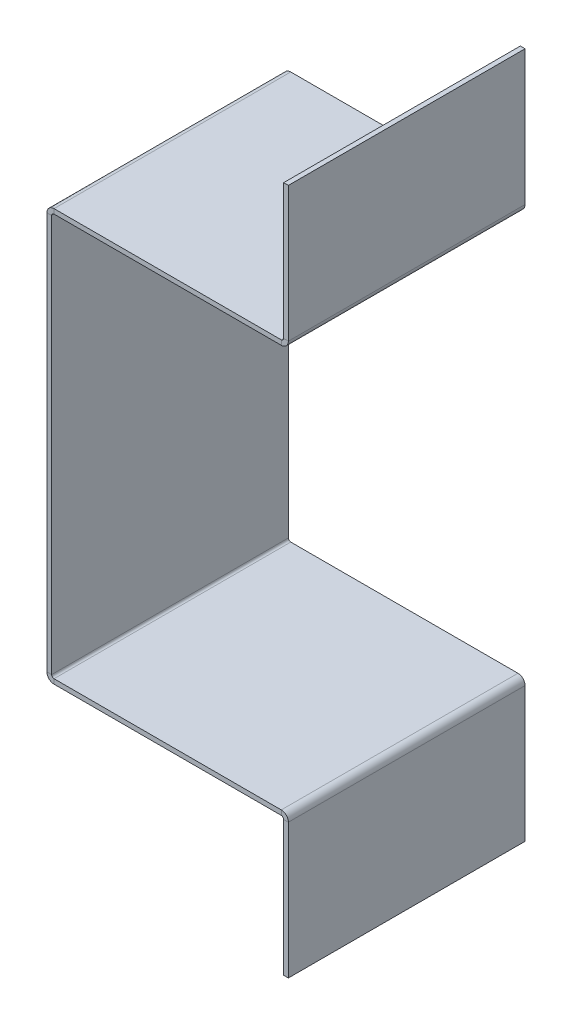
ISO-10303-21;
HEADER;
FILE_DESCRIPTION(('STEP AP214'),'2;1');
FILE_NAME('part.step','',(''),(''),'','','');
FILE_SCHEMA(('AUTOMOTIVE_DESIGN { 1 0 10303 214 1 1 1 1 }'));
ENDSEC;
DATA;
#1=APPLICATION_CONTEXT('core data for automotive mechanical design processes');
#2=APPLICATION_PROTOCOL_DEFINITION('international standard','automotive_design',2000,#1);
#3=PRODUCT_CONTEXT('',#1,'mechanical');
#4=PRODUCT('Part','Part','',(#3));
#5=PRODUCT_RELATED_PRODUCT_CATEGORY('part','',(#4));
#6=PRODUCT_DEFINITION_FORMATION('','',#4);
#7=PRODUCT_DEFINITION_CONTEXT('part definition',#1,'design');
#8=PRODUCT_DEFINITION('design','',#6,#7);
#9=PRODUCT_DEFINITION_SHAPE('','',#8);
#10=(LENGTH_UNIT() NAMED_UNIT(*) SI_UNIT(.MILLI.,.METRE.));
#11=(NAMED_UNIT(*) PLANE_ANGLE_UNIT() SI_UNIT($,.RADIAN.));
#12=(NAMED_UNIT(*) SI_UNIT($,.STERADIAN.) SOLID_ANGLE_UNIT());
#13=UNCERTAINTY_MEASURE_WITH_UNIT(LENGTH_MEASURE(1.E-05),#10,'distance_accuracy_value','');
#14=(GEOMETRIC_REPRESENTATION_CONTEXT(3) GLOBAL_UNCERTAINTY_ASSIGNED_CONTEXT((#13)) GLOBAL_UNIT_ASSIGNED_CONTEXT((#10,
#11,#12)) REPRESENTATION_CONTEXT('',''));
#15=CARTESIAN_POINT('',(0.,0.,0.));
#16=DIRECTION('',(0.,0.,1.));
#17=DIRECTION('',(1.,0.,0.));
#18=AXIS2_PLACEMENT_3D('',#15,#16,#17);
#19=CARTESIAN_POINT('',(-233.505441467645,-82.5271745369763,100.));
#20=DIRECTION('',(0.,0.,1.));
#21=DIRECTION('',(1.,0.,0.));
#22=AXIS2_PLACEMENT_3D('',#19,#20,#21);
#23=PLANE('',#22);
#24=DIRECTION('',(0.,-1.,0.));
#25=VECTOR('',#24,1.);
#26=CARTESIAN_POINT('',(-136.505441467645,-82.5271745369763,100.));
#27=LINE('',#26,#25);
#28=CARTESIAN_POINT('',(-136.505441467645,-82.5271745369763,100.));
#29=VERTEX_POINT('',#28);
#30=CARTESIAN_POINT('',(-136.505441467645,-84.5271745369763,100.));
#31=VERTEX_POINT('',#30);
#32=EDGE_CURVE('E11',#29,#31,#27,.T.);
#33=ORIENTED_EDGE('',*,*,#32,.F.);
#34=DIRECTION('',(1.,0.,0.));
#35=VECTOR('',#34,1.);
#36=CARTESIAN_POINT('',(-233.505441467645,-82.5271745369763,100.));
#37=LINE('',#36,#35);
#38=CARTESIAN_POINT('',(-232.505441467645,-82.5271745369763,100.));
#39=VERTEX_POINT('',#38);
#40=EDGE_CURVE('E232',#39,#29,#37,.T.);
#41=ORIENTED_EDGE('',*,*,#40,.F.);
#42=DIRECTION('',(0.,-1.,0.));
#43=VECTOR('',#42,1.);
#44=CARTESIAN_POINT('',(-232.505441467645,-82.5271745369763,100.));
#45=LINE('',#44,#43);
#46=CARTESIAN_POINT('',(-232.505441467645,-84.5271745369763,100.));
#47=VERTEX_POINT('',#46);
#48=EDGE_CURVE('E51',#39,#47,#45,.T.);
#49=ORIENTED_EDGE('',*,*,#48,.T.);
#50=DIRECTION('',(-1.,0.,0.));
#51=VECTOR('',#50,1.);
#52=CARTESIAN_POINT('',(-233.505441467645,-84.5271745369763,100.));
#53=LINE('',#52,#51);
#54=EDGE_CURVE('E313',#47,#31,#53,.F.);
#55=ORIENTED_EDGE('',*,*,#54,.T.);
#56=EDGE_LOOP('',(#33,#41,#49,#55));
#57=FACE_BOUND('',#56,.T.);
#58=ADVANCED_FACE('F41',(#57),#23,.T.);
#59=CARTESIAN_POINT('',(-232.505441467645,-81.5271745369763,100.));
#60=DIRECTION('',(0.,0.,-1.));
#61=DIRECTION('',(-1.,0.,0.));
#62=AXIS2_PLACEMENT_3D('',#59,#60,#61);
#63=PLANE('',#62);
#64=ORIENTED_EDGE('',*,*,#48,.F.);
#65=CARTESIAN_POINT('',(-232.505441467645,-81.5271745369763,100.));
#66=DIRECTION('',(0.,0.,1.));
#67=DIRECTION('',(1.,0.,0.));
#68=AXIS2_PLACEMENT_3D('',#65,#66,#67);
#69=CIRCLE('',#68,1.);
#70=CARTESIAN_POINT('',(-233.505441467645,-81.5271745369763,100.));
#71=VERTEX_POINT('',#70);
#72=EDGE_CURVE('E200',#39,#71,#69,.F.);
#73=ORIENTED_EDGE('',*,*,#72,.T.);
#74=DIRECTION('',(-1.,0.,0.));
#75=VECTOR('',#74,1.);
#76=CARTESIAN_POINT('',(-233.505441467645,-81.5271745369763,100.));
#77=LINE('',#76,#75);
#78=CARTESIAN_POINT('',(-235.505441467645,-81.5271745369763,100.));
#79=VERTEX_POINT('',#78);
#80=EDGE_CURVE('E166',#71,#79,#77,.T.);
#81=ORIENTED_EDGE('',*,*,#80,.T.);
#82=CARTESIAN_POINT('',(-232.505441467645,-81.5271745369763,100.));
#83=DIRECTION('',(0.,0.,-1.));
#84=DIRECTION('',(-1.,0.,0.));
#85=AXIS2_PLACEMENT_3D('',#82,#83,#84);
#86=CIRCLE('',#85,3.);
#87=EDGE_CURVE('E328',#47,#79,#86,.T.);
#88=ORIENTED_EDGE('',*,*,#87,.F.);
#89=EDGE_LOOP('',(#64,#73,#81,#88));
#90=FACE_BOUND('',#89,.T.);
#91=ADVANCED_FACE('F329',(#90),#63,.F.);
#92=CARTESIAN_POINT('',(-233.505441467645,87.4728254630238,100.));
#93=DIRECTION('',(0.,0.,1.));
#94=DIRECTION('',(0.,-1.,0.));
#95=AXIS2_PLACEMENT_3D('',#92,#93,#94);
#96=PLANE('',#95);
#97=ORIENTED_EDGE('',*,*,#80,.F.);
#98=DIRECTION('',(0.,-1.,0.));
#99=VECTOR('',#98,1.);
#100=CARTESIAN_POINT('',(-233.505441467645,87.4728254630238,100.));
#101=LINE('',#100,#99);
#102=CARTESIAN_POINT('',(-233.505441467645,86.4728254630238,100.));
#103=VERTEX_POINT('',#102);
#104=EDGE_CURVE('E190',#103,#71,#101,.T.);
#105=ORIENTED_EDGE('',*,*,#104,.F.);
#106=DIRECTION('',(-1.,0.,0.));
#107=VECTOR('',#106,1.);
#108=CARTESIAN_POINT('',(-233.505441467645,86.4728254630238,100.));
#109=LINE('',#108,#107);
#110=CARTESIAN_POINT('',(-235.505441467645,86.4728254630238,100.));
#111=VERTEX_POINT('',#110);
#112=EDGE_CURVE('E306',#103,#111,#109,.T.);
#113=ORIENTED_EDGE('',*,*,#112,.T.);
#114=DIRECTION('',(0.,1.,0.));
#115=VECTOR('',#114,1.);
#116=CARTESIAN_POINT('',(-235.505441467645,87.4728254630238,100.));
#117=LINE('',#116,#115);
#118=EDGE_CURVE('E372',#111,#79,#117,.F.);
#119=ORIENTED_EDGE('',*,*,#118,.T.);
#120=EDGE_LOOP('',(#97,#105,#113,#119));
#121=FACE_BOUND('',#120,.T.);
#122=ADVANCED_FACE('F398',(#121),#96,.T.);
#123=CARTESIAN_POINT('',(-232.505441467645,86.4728254630238,100.));
#124=DIRECTION('',(0.,0.,-1.));
#125=DIRECTION('',(-1.,0.,0.));
#126=AXIS2_PLACEMENT_3D('',#123,#124,#125);
#127=PLANE('',#126);
#128=ORIENTED_EDGE('',*,*,#112,.F.);
#129=CARTESIAN_POINT('',(-232.505441467645,86.4728254630238,100.));
#130=DIRECTION('',(0.,0.,1.));
#131=DIRECTION('',(1.,0.,0.));
#132=AXIS2_PLACEMENT_3D('',#129,#130,#131);
#133=CIRCLE('',#132,1.);
#134=CARTESIAN_POINT('',(-232.505441467645,87.4728254630238,100.));
#135=VERTEX_POINT('',#134);
#136=EDGE_CURVE('E263',#103,#135,#133,.F.);
#137=ORIENTED_EDGE('',*,*,#136,.T.);
#138=DIRECTION('',(0.,1.,0.));
#139=VECTOR('',#138,1.);
#140=CARTESIAN_POINT('',(-232.505441467645,87.4728254630238,100.));
#141=LINE('',#140,#139);
#142=CARTESIAN_POINT('',(-232.505441467645,89.4728254630238,100.));
#143=VERTEX_POINT('',#142);
#144=EDGE_CURVE('E304',#135,#143,#141,.T.);
#145=ORIENTED_EDGE('',*,*,#144,.T.);
#146=CARTESIAN_POINT('',(-232.505441467645,86.4728254630238,100.));
#147=DIRECTION('',(0.,0.,-1.));
#148=DIRECTION('',(-1.,0.,0.));
#149=AXIS2_PLACEMENT_3D('',#146,#147,#148);
#150=CIRCLE('',#149,3.);
#151=EDGE_CURVE('E375',#111,#143,#150,.T.);
#152=ORIENTED_EDGE('',*,*,#151,.F.);
#153=EDGE_LOOP('',(#128,#137,#145,#152));
#154=FACE_BOUND('',#153,.T.);
#155=ADVANCED_FACE('F457',(#154),#127,.F.);
#156=CARTESIAN_POINT('',(-233.505441467645,87.4728254630238,100.));
#157=DIRECTION('',(0.,0.,1.));
#158=DIRECTION('',(-1.,0.,0.));
#159=AXIS2_PLACEMENT_3D('',#156,#157,#158);
#160=PLANE('',#159);
#161=ORIENTED_EDGE('',*,*,#144,.F.);
#162=DIRECTION('',(-1.,0.,0.));
#163=VECTOR('',#162,1.);
#164=CARTESIAN_POINT('',(-233.505441467645,87.4728254630238,100.));
#165=LINE('',#164,#163);
#166=CARTESIAN_POINT('',(-136.505441467645,87.4728254630238,100.));
#167=VERTEX_POINT('',#166);
#168=EDGE_CURVE('E217',#167,#135,#165,.T.);
#169=ORIENTED_EDGE('',*,*,#168,.F.);
#170=DIRECTION('',(0.,1.,0.));
#171=VECTOR('',#170,1.);
#172=CARTESIAN_POINT('',(-136.505441467645,87.4728254630238,100.));
#173=LINE('',#172,#171);
#174=CARTESIAN_POINT('',(-136.505441467645,89.4728254630238,100.));
#175=VERTEX_POINT('',#174);
#176=EDGE_CURVE('E302',#167,#175,#173,.T.);
#177=ORIENTED_EDGE('',*,*,#176,.T.);
#178=DIRECTION('',(1.,0.,0.));
#179=VECTOR('',#178,1.);
#180=CARTESIAN_POINT('',(-233.505441467645,89.4728254630238,100.));
#181=LINE('',#180,#179);
#182=EDGE_CURVE('E379',#175,#143,#181,.F.);
#183=ORIENTED_EDGE('',*,*,#182,.T.);
#184=EDGE_LOOP('',(#161,#169,#177,#183));
#185=FACE_BOUND('',#184,.T.);
#186=ADVANCED_FACE('F454',(#185),#160,.T.);
#187=CARTESIAN_POINT('',(-136.505441467645,90.4728254630238,100.));
#188=DIRECTION('',(0.,0.,1.));
#189=DIRECTION('',(1.,0.,0.));
#190=AXIS2_PLACEMENT_3D('',#187,#188,#189);
#191=PLANE('',#190);
#192=ORIENTED_EDGE('',*,*,#176,.F.);
#193=CARTESIAN_POINT('',(-136.505441467645,90.4728254630238,100.));
#194=DIRECTION('',(0.,0.,-1.));
#195=DIRECTION('',(-1.,0.,0.));
#196=AXIS2_PLACEMENT_3D('',#193,#194,#195);
#197=CIRCLE('',#196,3.);
#198=CARTESIAN_POINT('',(-133.505441467645,90.4728254630238,100.));
#199=VERTEX_POINT('',#198);
#200=EDGE_CURVE('E252',#167,#199,#197,.F.);
#201=ORIENTED_EDGE('',*,*,#200,.T.);
#202=DIRECTION('',(-1.,0.,0.));
#203=VECTOR('',#202,1.);
#204=CARTESIAN_POINT('',(-133.505441467645,90.4728254630238,100.));
#205=LINE('',#204,#203);
#206=CARTESIAN_POINT('',(-135.505441467645,90.4728254630238,100.));
#207=VERTEX_POINT('',#206);
#208=EDGE_CURVE('E300',#199,#207,#205,.T.);
#209=ORIENTED_EDGE('',*,*,#208,.T.);
#210=CARTESIAN_POINT('',(-136.505441467645,90.4728254630238,100.));
#211=DIRECTION('',(0.,0.,1.));
#212=DIRECTION('',(1.,0.,0.));
#213=AXIS2_PLACEMENT_3D('',#210,#211,#212);
#214=CIRCLE('',#213,1.);
#215=EDGE_CURVE('E366',#175,#207,#214,.T.);
#216=ORIENTED_EDGE('',*,*,#215,.F.);
#217=EDGE_LOOP('',(#192,#201,#209,#216));
#218=FACE_BOUND('',#217,.T.);
#219=ADVANCED_FACE('F451',(#218),#191,.T.);
#220=CARTESIAN_POINT('',(-133.505441467645,147.472825463024,100.));
#221=DIRECTION('',(0.,0.,1.));
#222=DIRECTION('',(0.,-1.,0.));
#223=AXIS2_PLACEMENT_3D('',#220,#221,#222);
#224=PLANE('',#223);
#225=ORIENTED_EDGE('',*,*,#208,.F.);
#226=DIRECTION('',(0.,-1.,0.));
#227=VECTOR('',#226,1.);
#228=CARTESIAN_POINT('',(-133.505441467645,147.472825463024,100.));
#229=LINE('',#228,#227);
#230=CARTESIAN_POINT('',(-133.505441467645,147.472825463024,100.));
#231=VERTEX_POINT('',#230);
#232=EDGE_CURVE('E223',#231,#199,#229,.T.);
#233=ORIENTED_EDGE('',*,*,#232,.F.);
#234=DIRECTION('',(-1.,0.,0.));
#235=VECTOR('',#234,1.);
#236=CARTESIAN_POINT('',(-133.505441467645,147.472825463024,100.));
#237=LINE('',#236,#235);
#238=CARTESIAN_POINT('',(-135.505441467645,147.472825463024,100.));
#239=VERTEX_POINT('',#238);
#240=EDGE_CURVE('E298',#231,#239,#237,.T.);
#241=ORIENTED_EDGE('',*,*,#240,.T.);
#242=DIRECTION('',(0.,1.,0.));
#243=VECTOR('',#242,1.);
#244=CARTESIAN_POINT('',(-135.505441467645,147.472825463024,100.));
#245=LINE('',#244,#243);
#246=EDGE_CURVE('E386',#239,#207,#245,.F.);
#247=ORIENTED_EDGE('',*,*,#246,.T.);
#248=EDGE_LOOP('',(#225,#233,#241,#247));
#249=FACE_BOUND('',#248,.T.);
#250=ADVANCED_FACE('F442',(#249),#224,.T.);
#251=CARTESIAN_POINT('',(-133.505441467645,147.472825463024,100.));
#252=DIRECTION('',(0.,-1.,0.));
#253=DIRECTION('',(0.,0.,-1.));
#254=AXIS2_PLACEMENT_3D('',#251,#252,#253);
#255=PLANE('',#254);
#256=ORIENTED_EDGE('',*,*,#240,.F.);
#257=DIRECTION('',(0.,0.,-1.));
#258=VECTOR('',#257,1.);
#259=CARTESIAN_POINT('',(-133.505441467645,147.472825463024,100.));
#260=LINE('',#259,#258);
#261=CARTESIAN_POINT('',(-133.505441467645,147.472825463024,0.));
#262=VERTEX_POINT('',#261);
#263=EDGE_CURVE('E226',#231,#262,#260,.T.);
#264=ORIENTED_EDGE('',*,*,#263,.T.);
#265=DIRECTION('',(-1.,0.,0.));
#266=VECTOR('',#265,1.);
#267=CARTESIAN_POINT('',(-133.505441467645,147.472825463024,0.));
#268=LINE('',#267,#266);
#269=CARTESIAN_POINT('',(-135.505441467645,147.472825463024,0.));
#270=VERTEX_POINT('',#269);
#271=EDGE_CURVE('E296',#262,#270,#268,.T.);
#272=ORIENTED_EDGE('',*,*,#271,.T.);
#273=DIRECTION('',(0.,0.,1.));
#274=VECTOR('',#273,1.);
#275=CARTESIAN_POINT('',(-135.505441467645,147.472825463024,100.));
#276=LINE('',#275,#274);
#277=EDGE_CURVE('E368',#239,#270,#276,.F.);
#278=ORIENTED_EDGE('',*,*,#277,.F.);
#279=EDGE_LOOP('',(#256,#264,#272,#278));
#280=FACE_BOUND('',#279,.T.);
#281=ADVANCED_FACE('F438',(#280),#255,.F.);
#282=CARTESIAN_POINT('',(-133.505441467645,147.472825463024,0.));
#283=DIRECTION('',(0.,0.,1.));
#284=DIRECTION('',(0.,-1.,0.));
#285=AXIS2_PLACEMENT_3D('',#282,#283,#284);
#286=PLANE('',#285);
#287=ORIENTED_EDGE('',*,*,#271,.F.);
#288=DIRECTION('',(0.,-1.,0.));
#289=VECTOR('',#288,1.);
#290=CARTESIAN_POINT('',(-133.505441467645,147.472825463024,0.));
#291=LINE('',#290,#289);
#292=CARTESIAN_POINT('',(-133.505441467645,90.4728254630238,0.));
#293=VERTEX_POINT('',#292);
#294=EDGE_CURVE('E220',#262,#293,#291,.T.);
#295=ORIENTED_EDGE('',*,*,#294,.T.);
#296=DIRECTION('',(-1.,0.,0.));
#297=VECTOR('',#296,1.);
#298=CARTESIAN_POINT('',(-133.505441467645,90.4728254630238,0.));
#299=LINE('',#298,#297);
#300=CARTESIAN_POINT('',(-135.505441467645,90.4728254630238,0.));
#301=VERTEX_POINT('',#300);
#302=EDGE_CURVE('E294',#293,#301,#299,.T.);
#303=ORIENTED_EDGE('',*,*,#302,.T.);
#304=DIRECTION('',(0.,1.,0.));
#305=VECTOR('',#304,1.);
#306=CARTESIAN_POINT('',(-135.505441467645,147.472825463024,0.));
#307=LINE('',#306,#305);
#308=EDGE_CURVE('E383',#270,#301,#307,.F.);
#309=ORIENTED_EDGE('',*,*,#308,.F.);
#310=EDGE_LOOP('',(#287,#295,#303,#309));
#311=FACE_BOUND('',#310,.T.);
#312=ADVANCED_FACE('F431',(#311),#286,.F.);
#313=CARTESIAN_POINT('',(-136.505441467645,90.4728254630238,0.));
#314=DIRECTION('',(0.,0.,-1.));
#315=DIRECTION('',(-1.,0.,0.));
#316=AXIS2_PLACEMENT_3D('',#313,#314,#315);
#317=PLANE('',#316);
#318=ORIENTED_EDGE('',*,*,#302,.F.);
#319=CARTESIAN_POINT('',(-136.505441467645,90.4728254630238,0.));
#320=DIRECTION('',(0.,0.,1.));
#321=DIRECTION('',(1.,0.,0.));
#322=AXIS2_PLACEMENT_3D('',#319,#320,#321);
#323=CIRCLE('',#322,3.);
#324=CARTESIAN_POINT('',(-136.505441467645,87.4728254630238,0.));
#325=VERTEX_POINT('',#324);
#326=EDGE_CURVE('E260',#293,#325,#323,.F.);
#327=ORIENTED_EDGE('',*,*,#326,.T.);
#328=DIRECTION('',(0.,1.,0.));
#329=VECTOR('',#328,1.);
#330=CARTESIAN_POINT('',(-136.505441467645,87.4728254630238,0.));
#331=LINE('',#330,#329);
#332=CARTESIAN_POINT('',(-136.505441467645,89.4728254630238,0.));
#333=VERTEX_POINT('',#332);
#334=EDGE_CURVE('E292',#325,#333,#331,.T.);
#335=ORIENTED_EDGE('',*,*,#334,.T.);
#336=CARTESIAN_POINT('',(-136.505441467645,90.4728254630238,0.));
#337=DIRECTION('',(0.,0.,1.));
#338=DIRECTION('',(1.,0.,0.));
#339=AXIS2_PLACEMENT_3D('',#336,#337,#338);
#340=CIRCLE('',#339,1.);
#341=EDGE_CURVE('E380',#301,#333,#340,.F.);
#342=ORIENTED_EDGE('',*,*,#341,.F.);
#343=EDGE_LOOP('',(#318,#327,#335,#342));
#344=FACE_BOUND('',#343,.T.);
#345=ADVANCED_FACE('F424',(#344),#317,.T.);
#346=CARTESIAN_POINT('',(-233.505441467645,87.4728254630238,0.));
#347=DIRECTION('',(0.,0.,1.));
#348=DIRECTION('',(-1.,0.,0.));
#349=AXIS2_PLACEMENT_3D('',#346,#347,#348);
#350=PLANE('',#349);
#351=ORIENTED_EDGE('',*,*,#334,.F.);
#352=DIRECTION('',(-1.,0.,0.));
#353=VECTOR('',#352,1.);
#354=CARTESIAN_POINT('',(-233.505441467645,87.4728254630238,0.));
#355=LINE('',#354,#353);
#356=CARTESIAN_POINT('',(-232.505441467645,87.4728254630238,0.));
#357=VERTEX_POINT('',#356);
#358=EDGE_CURVE('E206',#325,#357,#355,.T.);
#359=ORIENTED_EDGE('',*,*,#358,.T.);
#360=DIRECTION('',(0.,1.,0.));
#361=VECTOR('',#360,1.);
#362=CARTESIAN_POINT('',(-232.505441467645,87.4728254630238,0.));
#363=LINE('',#362,#361);
#364=CARTESIAN_POINT('',(-232.505441467645,89.4728254630238,0.));
#365=VERTEX_POINT('',#364);
#366=EDGE_CURVE('E290',#357,#365,#363,.T.);
#367=ORIENTED_EDGE('',*,*,#366,.T.);
#368=DIRECTION('',(1.,0.,0.));
#369=VECTOR('',#368,1.);
#370=CARTESIAN_POINT('',(-233.505441467645,89.4728254630238,0.));
#371=LINE('',#370,#369);
#372=EDGE_CURVE('E376',#333,#365,#371,.F.);
#373=ORIENTED_EDGE('',*,*,#372,.F.);
#374=EDGE_LOOP('',(#351,#359,#367,#373));
#375=FACE_BOUND('',#374,.T.);
#376=ADVANCED_FACE('F416',(#375),#350,.F.);
#377=CARTESIAN_POINT('',(-232.505441467645,86.4728254630238,0.));
#378=DIRECTION('',(0.,0.,1.));
#379=DIRECTION('',(1.,0.,0.));
#380=AXIS2_PLACEMENT_3D('',#377,#378,#379);
#381=PLANE('',#380);
#382=ORIENTED_EDGE('',*,*,#366,.F.);
#383=CARTESIAN_POINT('',(-232.505441467645,86.4728254630238,0.));
#384=DIRECTION('',(0.,0.,-1.));
#385=DIRECTION('',(-1.,0.,0.));
#386=AXIS2_PLACEMENT_3D('',#383,#384,#385);
#387=CIRCLE('',#386,1.);
#388=CARTESIAN_POINT('',(-233.505441467645,86.4728254630238,0.));
#389=VERTEX_POINT('',#388);
#390=EDGE_CURVE('E270',#357,#389,#387,.F.);
#391=ORIENTED_EDGE('',*,*,#390,.T.);
#392=DIRECTION('',(-1.,0.,0.));
#393=VECTOR('',#392,1.);
#394=CARTESIAN_POINT('',(-233.505441467645,86.4728254630238,0.));
#395=LINE('',#394,#393);
#396=CARTESIAN_POINT('',(-235.505441467645,86.4728254630238,0.));
#397=VERTEX_POINT('',#396);
#398=EDGE_CURVE('E179',#389,#397,#395,.T.);
#399=ORIENTED_EDGE('',*,*,#398,.T.);
#400=CARTESIAN_POINT('',(-232.505441467645,86.4728254630238,0.));
#401=DIRECTION('',(0.,0.,-1.));
#402=DIRECTION('',(-1.,0.,0.));
#403=AXIS2_PLACEMENT_3D('',#400,#401,#402);
#404=CIRCLE('',#403,3.);
#405=EDGE_CURVE('E331',#365,#397,#404,.F.);
#406=ORIENTED_EDGE('',*,*,#405,.F.);
#407=EDGE_LOOP('',(#382,#391,#399,#406));
#408=FACE_BOUND('',#407,.T.);
#409=ADVANCED_FACE('F408',(#408),#381,.F.);
#410=CARTESIAN_POINT('',(-233.505441467645,87.4728254630238,0.));
#411=DIRECTION('',(0.,0.,1.));
#412=DIRECTION('',(0.,-1.,0.));
#413=AXIS2_PLACEMENT_3D('',#410,#411,#412);
#414=PLANE('',#413);
#415=ORIENTED_EDGE('',*,*,#398,.F.);
#416=DIRECTION('',(0.,-1.,0.));
#417=VECTOR('',#416,1.);
#418=CARTESIAN_POINT('',(-233.505441467645,87.4728254630238,0.));
#419=LINE('',#418,#417);
#420=CARTESIAN_POINT('',(-233.505441467645,-81.5271745369763,0.));
#421=VERTEX_POINT('',#420);
#422=EDGE_CURVE('E188',#389,#421,#419,.T.);
#423=ORIENTED_EDGE('',*,*,#422,.T.);
#424=DIRECTION('',(-1.,0.,0.));
#425=VECTOR('',#424,1.);
#426=CARTESIAN_POINT('',(-233.505441467645,-81.5271745369763,0.));
#427=LINE('',#426,#425);
#428=CARTESIAN_POINT('',(-235.505441467645,-81.5271745369763,0.));
#429=VERTEX_POINT('',#428);
#430=EDGE_CURVE('E59',#421,#429,#427,.T.);
#431=ORIENTED_EDGE('',*,*,#430,.T.);
#432=DIRECTION('',(0.,1.,0.));
#433=VECTOR('',#432,1.);
#434=CARTESIAN_POINT('',(-235.505441467645,87.4728254630238,0.));
#435=LINE('',#434,#433);
#436=EDGE_CURVE('E370',#397,#429,#435,.F.);
#437=ORIENTED_EDGE('',*,*,#436,.F.);
#438=EDGE_LOOP('',(#415,#423,#431,#437));
#439=FACE_BOUND('',#438,.T.);
#440=ADVANCED_FACE('F202',(#439),#414,.F.);
#441=CARTESIAN_POINT('',(-232.505441467645,-81.5271745369763,0.));
#442=DIRECTION('',(0.,0.,1.));
#443=DIRECTION('',(1.,0.,0.));
#444=AXIS2_PLACEMENT_3D('',#441,#442,#443);
#445=PLANE('',#444);
#446=ORIENTED_EDGE('',*,*,#430,.F.);
#447=CARTESIAN_POINT('',(-232.505441467645,-81.5271745369763,0.));
#448=DIRECTION('',(0.,0.,-1.));
#449=DIRECTION('',(-1.,0.,0.));
#450=AXIS2_PLACEMENT_3D('',#447,#448,#449);
#451=CIRCLE('',#450,1.);
#452=CARTESIAN_POINT('',(-232.505441467645,-82.5271745369763,0.));
#453=VERTEX_POINT('',#452);
#454=EDGE_CURVE('E175',#421,#453,#451,.F.);
#455=ORIENTED_EDGE('',*,*,#454,.T.);
#456=DIRECTION('',(0.,-1.,0.));
#457=VECTOR('',#456,1.);
#458=CARTESIAN_POINT('',(-232.505441467645,-82.5271745369763,0.));
#459=LINE('',#458,#457);
#460=CARTESIAN_POINT('',(-232.505441467645,-84.5271745369763,0.));
#461=VERTEX_POINT('',#460);
#462=EDGE_CURVE('E180',#453,#461,#459,.T.);
#463=ORIENTED_EDGE('',*,*,#462,.T.);
#464=CARTESIAN_POINT('',(-232.505441467645,-81.5271745369763,0.));
#465=DIRECTION('',(0.,0.,-1.));
#466=DIRECTION('',(-1.,0.,0.));
#467=AXIS2_PLACEMENT_3D('',#464,#465,#466);
#468=CIRCLE('',#467,3.);
#469=EDGE_CURVE('E177',#429,#461,#468,.F.);
#470=ORIENTED_EDGE('',*,*,#469,.F.);
#471=EDGE_LOOP('',(#446,#455,#463,#470));
#472=FACE_BOUND('',#471,.T.);
#473=ADVANCED_FACE('F172',(#472),#445,.F.);
#474=CARTESIAN_POINT('',(-233.505441467645,-82.5271745369763,0.));
#475=DIRECTION('',(0.,0.,1.));
#476=DIRECTION('',(1.,0.,0.));
#477=AXIS2_PLACEMENT_3D('',#474,#475,#476);
#478=PLANE('',#477);
#479=ORIENTED_EDGE('',*,*,#462,.F.);
#480=DIRECTION('',(1.,0.,0.));
#481=VECTOR('',#480,1.);
#482=CARTESIAN_POINT('',(-233.505441467645,-82.5271745369763,0.));
#483=LINE('',#482,#481);
#484=CARTESIAN_POINT('',(-136.505441467645,-82.5271745369763,0.));
#485=VERTEX_POINT('',#484);
#486=EDGE_CURVE('E229',#453,#485,#483,.T.);
#487=ORIENTED_EDGE('',*,*,#486,.T.);
#488=DIRECTION('',(0.,-1.,0.));
#489=VECTOR('',#488,1.);
#490=CARTESIAN_POINT('',(-136.505441467645,-82.5271745369763,0.));
#491=LINE('',#490,#489);
#492=CARTESIAN_POINT('',(-136.505441467645,-84.5271745369763,0.));
#493=VERTEX_POINT('',#492);
#494=EDGE_CURVE('E285',#485,#493,#491,.T.);
#495=ORIENTED_EDGE('',*,*,#494,.T.);
#496=DIRECTION('',(-1.,0.,0.));
#497=VECTOR('',#496,1.);
#498=CARTESIAN_POINT('',(-233.505441467645,-84.5271745369763,0.));
#499=LINE('',#498,#497);
#500=EDGE_CURVE('E326',#461,#493,#499,.F.);
#501=ORIENTED_EDGE('',*,*,#500,.F.);
#502=EDGE_LOOP('',(#479,#487,#495,#501));
#503=FACE_BOUND('',#502,.T.);
#504=ADVANCED_FACE('F578',(#503),#478,.F.);
#505=CARTESIAN_POINT('',(-136.505441467645,-85.5271745369763,0.));
#506=DIRECTION('',(0.,0.,-1.));
#507=DIRECTION('',(-1.,0.,0.));
#508=AXIS2_PLACEMENT_3D('',#505,#506,#507);
#509=PLANE('',#508);
#510=ORIENTED_EDGE('',*,*,#494,.F.);
#511=CARTESIAN_POINT('',(-136.505441467645,-85.5271745369763,0.));
#512=DIRECTION('',(0.,0.,1.));
#513=DIRECTION('',(1.,0.,0.));
#514=AXIS2_PLACEMENT_3D('',#511,#512,#513);
#515=CIRCLE('',#514,3.);
#516=CARTESIAN_POINT('',(-133.505441467645,-85.5271745369763,0.));
#517=VERTEX_POINT('',#516);
#518=EDGE_CURVE('E209',#485,#517,#515,.F.);
#519=ORIENTED_EDGE('',*,*,#518,.T.);
#520=DIRECTION('',(-1.,0.,0.));
#521=VECTOR('',#520,1.);
#522=CARTESIAN_POINT('',(-133.505441467645,-85.5271745369763,0.));
#523=LINE('',#522,#521);
#524=CARTESIAN_POINT('',(-135.505441467645,-85.5271745369763,0.));
#525=VERTEX_POINT('',#524);
#526=EDGE_CURVE('E282',#517,#525,#523,.T.);
#527=ORIENTED_EDGE('',*,*,#526,.T.);
#528=CARTESIAN_POINT('',(-136.505441467645,-85.5271745369763,0.));
#529=DIRECTION('',(0.,0.,1.));
#530=DIRECTION('',(1.,0.,0.));
#531=AXIS2_PLACEMENT_3D('',#528,#529,#530);
#532=CIRCLE('',#531,1.);
#533=EDGE_CURVE('E363',#493,#525,#532,.F.);
#534=ORIENTED_EDGE('',*,*,#533,.F.);
#535=EDGE_LOOP('',(#510,#519,#527,#534));
#536=FACE_BOUND('',#535,.T.);
#537=ADVANCED_FACE('F587',(#536),#509,.T.);
#538=CARTESIAN_POINT('',(-133.505441467645,-142.527174536976,0.));
#539=DIRECTION('',(0.,0.,1.));
#540=DIRECTION('',(0.,-1.,0.));
#541=AXIS2_PLACEMENT_3D('',#538,#539,#540);
#542=PLANE('',#541);
#543=ORIENTED_EDGE('',*,*,#526,.F.);
#544=DIRECTION('',(0.,-1.,0.));
#545=VECTOR('',#544,1.);
#546=CARTESIAN_POINT('',(-133.505441467645,-142.527174536976,0.));
#547=LINE('',#546,#545);
#548=CARTESIAN_POINT('',(-133.505441467645,-142.527174536976,0.));
#549=VERTEX_POINT('',#548);
#550=EDGE_CURVE('E235',#517,#549,#547,.T.);
#551=ORIENTED_EDGE('',*,*,#550,.T.);
#552=DIRECTION('',(-1.,0.,0.));
#553=VECTOR('',#552,1.);
#554=CARTESIAN_POINT('',(-133.505441467645,-142.527174536976,0.));
#555=LINE('',#554,#553);
#556=CARTESIAN_POINT('',(-135.505441467645,-142.527174536976,0.));
#557=VERTEX_POINT('',#556);
#558=EDGE_CURVE('E279',#549,#557,#555,.T.);
#559=ORIENTED_EDGE('',*,*,#558,.T.);
#560=DIRECTION('',(0.,1.,0.));
#561=VECTOR('',#560,1.);
#562=CARTESIAN_POINT('',(-135.505441467645,-142.527174536976,0.));
#563=LINE('',#562,#561);
#564=EDGE_CURVE('E325',#525,#557,#563,.F.);
#565=ORIENTED_EDGE('',*,*,#564,.F.);
#566=EDGE_LOOP('',(#543,#551,#559,#565));
#567=FACE_BOUND('',#566,.T.);
#568=ADVANCED_FACE('F599',(#567),#542,.F.);
#569=CARTESIAN_POINT('',(-133.505441467645,-142.527174536976,100.));
#570=DIRECTION('',(0.,-1.,0.));
#571=DIRECTION('',(0.,0.,-1.));
#572=AXIS2_PLACEMENT_3D('',#569,#570,#571);
#573=PLANE('',#572);
#574=ORIENTED_EDGE('',*,*,#558,.F.);
#575=DIRECTION('',(0.,0.,-1.));
#576=VECTOR('',#575,1.);
#577=CARTESIAN_POINT('',(-133.505441467645,-142.527174536976,100.));
#578=LINE('',#577,#576);
#579=CARTESIAN_POINT('',(-133.505441467645,-142.527174536976,100.));
#580=VERTEX_POINT('',#579);
#581=EDGE_CURVE('E238',#580,#549,#578,.T.);
#582=ORIENTED_EDGE('',*,*,#581,.F.);
#583=DIRECTION('',(-1.,0.,0.));
#584=VECTOR('',#583,1.);
#585=CARTESIAN_POINT('',(-133.505441467645,-142.527174536976,100.));
#586=LINE('',#585,#584);
#587=CARTESIAN_POINT('',(-135.505441467645,-142.527174536976,100.));
#588=VERTEX_POINT('',#587);
#589=EDGE_CURVE('E276',#580,#588,#586,.T.);
#590=ORIENTED_EDGE('',*,*,#589,.T.);
#591=DIRECTION('',(0.,0.,1.));
#592=VECTOR('',#591,1.);
#593=CARTESIAN_POINT('',(-135.505441467645,-142.527174536976,100.));
#594=LINE('',#593,#592);
#595=EDGE_CURVE('E358',#588,#557,#594,.F.);
#596=ORIENTED_EDGE('',*,*,#595,.T.);
#597=EDGE_LOOP('',(#574,#582,#590,#596));
#598=FACE_BOUND('',#597,.T.);
#599=ADVANCED_FACE('F609',(#598),#573,.T.);
#600=CARTESIAN_POINT('',(-133.505441467645,-142.527174536976,100.));
#601=DIRECTION('',(0.,0.,1.));
#602=DIRECTION('',(0.,-1.,0.));
#603=AXIS2_PLACEMENT_3D('',#600,#601,#602);
#604=PLANE('',#603);
#605=ORIENTED_EDGE('',*,*,#589,.F.);
#606=DIRECTION('',(0.,-1.,0.));
#607=VECTOR('',#606,1.);
#608=CARTESIAN_POINT('',(-133.505441467645,-142.527174536976,100.));
#609=LINE('',#608,#607);
#610=CARTESIAN_POINT('',(-133.505441467645,-85.5271745369763,100.));
#611=VERTEX_POINT('',#610);
#612=EDGE_CURVE('E241',#611,#580,#609,.T.);
#613=ORIENTED_EDGE('',*,*,#612,.F.);
#614=DIRECTION('',(-1.,0.,0.));
#615=VECTOR('',#614,1.);
#616=CARTESIAN_POINT('',(-133.505441467645,-85.5271745369763,100.));
#617=LINE('',#616,#615);
#618=CARTESIAN_POINT('',(-135.505441467645,-85.5271745369763,100.));
#619=VERTEX_POINT('',#618);
#620=EDGE_CURVE('E45',#611,#619,#617,.T.);
#621=ORIENTED_EDGE('',*,*,#620,.T.);
#622=DIRECTION('',(0.,1.,0.));
#623=VECTOR('',#622,1.);
#624=CARTESIAN_POINT('',(-135.505441467645,-142.527174536976,100.));
#625=LINE('',#624,#623);
#626=EDGE_CURVE('E354',#619,#588,#625,.F.);
#627=ORIENTED_EDGE('',*,*,#626,.T.);
#628=EDGE_LOOP('',(#605,#613,#621,#627));
#629=FACE_BOUND('',#628,.T.);
#630=ADVANCED_FACE('F620',(#629),#604,.T.);
#631=CARTESIAN_POINT('',(-136.505441467645,-85.5271745369763,100.));
#632=DIRECTION('',(0.,0.,1.));
#633=DIRECTION('',(1.,0.,0.));
#634=AXIS2_PLACEMENT_3D('',#631,#632,#633);
#635=PLANE('',#634);
#636=CARTESIAN_POINT('',(-136.505441467645,-85.5271745369763,100.));
#637=DIRECTION('',(0.,0.,-1.));
#638=DIRECTION('',(-1.,0.,0.));
#639=AXIS2_PLACEMENT_3D('',#636,#637,#638);
#640=CIRCLE('',#639,3.);
#641=EDGE_CURVE('E204',#611,#29,#640,.F.);
#642=ORIENTED_EDGE('',*,*,#641,.T.);
#643=ORIENTED_EDGE('',*,*,#32,.T.);
#644=CARTESIAN_POINT('',(-136.505441467645,-85.5271745369763,100.));
#645=DIRECTION('',(0.,0.,1.));
#646=DIRECTION('',(1.,0.,0.));
#647=AXIS2_PLACEMENT_3D('',#644,#645,#646);
#648=CIRCLE('',#647,1.);
#649=EDGE_CURVE('E212',#619,#31,#648,.T.);
#650=ORIENTED_EDGE('',*,*,#649,.F.);
#651=ORIENTED_EDGE('',*,*,#620,.F.);
#652=EDGE_LOOP('',(#642,#643,#650,#651));
#653=FACE_BOUND('',#652,.T.);
#654=ADVANCED_FACE('F43',(#653),#635,.T.);
#655=CARTESIAN_POINT('',(-135.505441467645,-142.527174536976,100.));
#656=DIRECTION('',(1.,0.,0.));
#657=DIRECTION('',(0.,1.,0.));
#658=AXIS2_PLACEMENT_3D('',#655,#656,#657);
#659=PLANE('',#658);
#660=ORIENTED_EDGE('',*,*,#626,.F.);
#661=DIRECTION('',(0.,0.,1.));
#662=VECTOR('',#661,1.);
#663=CARTESIAN_POINT('',(-135.505441467645,-85.5271745369763,100.));
#664=LINE('',#663,#662);
#665=EDGE_CURVE('E357',#619,#525,#664,.F.);
#666=ORIENTED_EDGE('',*,*,#665,.T.);
#667=ORIENTED_EDGE('',*,*,#564,.T.);
#668=ORIENTED_EDGE('',*,*,#595,.F.);
#669=EDGE_LOOP('',(#660,#666,#667,#668));
#670=FACE_BOUND('',#669,.T.);
#671=ADVANCED_FACE('F643',(#670),#659,.F.);
#672=CARTESIAN_POINT('',(-233.505441467645,-84.5271745369763,100.));
#673=DIRECTION('',(0.,1.,0.));
#674=DIRECTION('',(-1.,0.,0.));
#675=AXIS2_PLACEMENT_3D('',#672,#673,#674);
#676=PLANE('',#675);
#677=ORIENTED_EDGE('',*,*,#54,.F.);
#678=DIRECTION('',(0.,0.,1.));
#679=VECTOR('',#678,1.);
#680=CARTESIAN_POINT('',(-232.505441467645,-84.5271745369763,100.));
#681=LINE('',#680,#679);
#682=EDGE_CURVE('E322',#47,#461,#681,.F.);
#683=ORIENTED_EDGE('',*,*,#682,.T.);
#684=ORIENTED_EDGE('',*,*,#500,.T.);
#685=DIRECTION('',(0.,0.,1.));
#686=VECTOR('',#685,1.);
#687=CARTESIAN_POINT('',(-136.505441467645,-84.5271745369763,100.));
#688=LINE('',#687,#686);
#689=EDGE_CURVE('E324',#493,#31,#688,.T.);
#690=ORIENTED_EDGE('',*,*,#689,.T.);
#691=EDGE_LOOP('',(#677,#683,#684,#690));
#692=FACE_BOUND('',#691,.T.);
#693=ADVANCED_FACE('F319',(#692),#676,.F.);
#694=CARTESIAN_POINT('',(-135.505441467645,147.472825463024,100.));
#695=DIRECTION('',(1.,0.,0.));
#696=DIRECTION('',(0.,1.,0.));
#697=AXIS2_PLACEMENT_3D('',#694,#695,#696);
#698=PLANE('',#697);
#699=ORIENTED_EDGE('',*,*,#308,.T.);
#700=DIRECTION('',(0.,0.,1.));
#701=VECTOR('',#700,1.);
#702=CARTESIAN_POINT('',(-135.505441467645,90.4728254630238,100.));
#703=LINE('',#702,#701);
#704=EDGE_CURVE('E347',#301,#207,#703,.T.);
#705=ORIENTED_EDGE('',*,*,#704,.T.);
#706=ORIENTED_EDGE('',*,*,#246,.F.);
#707=ORIENTED_EDGE('',*,*,#277,.T.);
#708=EDGE_LOOP('',(#699,#705,#706,#707));
#709=FACE_BOUND('',#708,.T.);
#710=ADVANCED_FACE('F444',(#709),#698,.F.);
#711=CARTESIAN_POINT('',(-233.505441467645,89.4728254630238,100.));
#712=DIRECTION('',(0.,-1.,0.));
#713=DIRECTION('',(0.,0.,-1.));
#714=AXIS2_PLACEMENT_3D('',#711,#712,#713);
#715=PLANE('',#714);
#716=ORIENTED_EDGE('',*,*,#372,.T.);
#717=DIRECTION('',(0.,0.,-1.));
#718=VECTOR('',#717,1.);
#719=CARTESIAN_POINT('',(-232.505441467645,89.4728254630238,100.));
#720=LINE('',#719,#718);
#721=EDGE_CURVE('E336',#365,#143,#720,.F.);
#722=ORIENTED_EDGE('',*,*,#721,.T.);
#723=ORIENTED_EDGE('',*,*,#182,.F.);
#724=DIRECTION('',(0.,0.,-1.));
#725=VECTOR('',#724,1.);
#726=CARTESIAN_POINT('',(-136.505441467645,89.4728254630238,100.));
#727=LINE('',#726,#725);
#728=EDGE_CURVE('E349',#175,#333,#727,.T.);
#729=ORIENTED_EDGE('',*,*,#728,.T.);
#730=EDGE_LOOP('',(#716,#722,#723,#729));
#731=FACE_BOUND('',#730,.T.);
#732=ADVANCED_FACE('F671',(#731),#715,.F.);
#733=CARTESIAN_POINT('',(-235.505441467645,87.4728254630238,100.));
#734=DIRECTION('',(1.,0.,0.));
#735=DIRECTION('',(0.,1.,0.));
#736=AXIS2_PLACEMENT_3D('',#733,#734,#735);
#737=PLANE('',#736);
#738=ORIENTED_EDGE('',*,*,#436,.T.);
#739=DIRECTION('',(0.,0.,1.));
#740=VECTOR('',#739,1.);
#741=CARTESIAN_POINT('',(-235.505441467645,-81.5271745369763,100.));
#742=LINE('',#741,#740);
#743=EDGE_CURVE('E335',#429,#79,#742,.T.);
#744=ORIENTED_EDGE('',*,*,#743,.T.);
#745=ORIENTED_EDGE('',*,*,#118,.F.);
#746=DIRECTION('',(0.,0.,1.));
#747=VECTOR('',#746,1.);
#748=CARTESIAN_POINT('',(-235.505441467645,86.4728254630238,100.));
#749=LINE('',#748,#747);
#750=EDGE_CURVE('E341',#111,#397,#749,.F.);
#751=ORIENTED_EDGE('',*,*,#750,.T.);
#752=EDGE_LOOP('',(#738,#744,#745,#751));
#753=FACE_BOUND('',#752,.T.);
#754=ADVANCED_FACE('F401',(#753),#737,.F.);
#755=CARTESIAN_POINT('',(-136.505441467645,-85.5271745369763,100.));
#756=DIRECTION('',(0.,0.,1.));
#757=DIRECTION('',(1.,0.,0.));
#758=AXIS2_PLACEMENT_3D('',#755,#756,#757);
#759=CYLINDRICAL_SURFACE('',#758,1.);
#760=ORIENTED_EDGE('',*,*,#649,.T.);
#761=ORIENTED_EDGE('',*,*,#689,.F.);
#762=ORIENTED_EDGE('',*,*,#533,.T.);
#763=ORIENTED_EDGE('',*,*,#665,.F.);
#764=EDGE_LOOP('',(#760,#761,#762,#763));
#765=FACE_BOUND('',#764,.T.);
#766=ADVANCED_FACE('F689',(#765),#759,.F.);
#767=CARTESIAN_POINT('',(-136.505441467645,90.4728254630238,100.));
#768=DIRECTION('',(0.,0.,1.));
#769=DIRECTION('',(1.,0.,0.));
#770=AXIS2_PLACEMENT_3D('',#767,#768,#769);
#771=CYLINDRICAL_SURFACE('',#770,1.);
#772=ORIENTED_EDGE('',*,*,#215,.T.);
#773=ORIENTED_EDGE('',*,*,#704,.F.);
#774=ORIENTED_EDGE('',*,*,#341,.T.);
#775=ORIENTED_EDGE('',*,*,#728,.F.);
#776=EDGE_LOOP('',(#772,#773,#774,#775));
#777=FACE_BOUND('',#776,.T.);
#778=ADVANCED_FACE('F447',(#777),#771,.F.);
#779=CARTESIAN_POINT('',(-232.505441467645,86.4728254630238,100.));
#780=DIRECTION('',(0.,0.,-1.));
#781=DIRECTION('',(-1.,0.,0.));
#782=AXIS2_PLACEMENT_3D('',#779,#780,#781);
#783=CYLINDRICAL_SURFACE('',#782,3.);
#784=ORIENTED_EDGE('',*,*,#151,.T.);
#785=ORIENTED_EDGE('',*,*,#721,.F.);
#786=ORIENTED_EDGE('',*,*,#405,.T.);
#787=ORIENTED_EDGE('',*,*,#750,.F.);
#788=EDGE_LOOP('',(#784,#785,#786,#787));
#789=FACE_BOUND('',#788,.T.);
#790=ADVANCED_FACE('F404',(#789),#783,.T.);
#791=CARTESIAN_POINT('',(-232.505441467645,-81.5271745369763,100.));
#792=DIRECTION('',(0.,0.,-1.));
#793=DIRECTION('',(-1.,0.,0.));
#794=AXIS2_PLACEMENT_3D('',#791,#792,#793);
#795=CYLINDRICAL_SURFACE('',#794,3.);
#796=ORIENTED_EDGE('',*,*,#87,.T.);
#797=ORIENTED_EDGE('',*,*,#743,.F.);
#798=ORIENTED_EDGE('',*,*,#469,.T.);
#799=ORIENTED_EDGE('',*,*,#682,.F.);
#800=EDGE_LOOP('',(#796,#797,#798,#799));
#801=FACE_BOUND('',#800,.T.);
#802=ADVANCED_FACE('F333',(#801),#795,.T.);
#803=CARTESIAN_POINT('',(-133.505441467645,-142.527174536976,100.));
#804=DIRECTION('',(1.,0.,0.));
#805=DIRECTION('',(0.,1.,0.));
#806=AXIS2_PLACEMENT_3D('',#803,#804,#805);
#807=PLANE('',#806);
#808=ORIENTED_EDGE('',*,*,#612,.T.);
#809=ORIENTED_EDGE('',*,*,#581,.T.);
#810=ORIENTED_EDGE('',*,*,#550,.F.);
#811=DIRECTION('',(0.,0.,-1.));
#812=VECTOR('',#811,1.);
#813=CARTESIAN_POINT('',(-133.505441467645,-85.5271745369763,0.));
#814=LINE('',#813,#812);
#815=EDGE_CURVE('E244',#611,#517,#814,.T.);
#816=ORIENTED_EDGE('',*,*,#815,.F.);
#817=EDGE_LOOP('',(#808,#809,#810,#816));
#818=FACE_BOUND('',#817,.T.);
#819=ADVANCED_FACE('F727',(#818),#807,.T.);
#820=CARTESIAN_POINT('',(-233.505441467645,-82.5271745369763,100.));
#821=DIRECTION('',(0.,1.,0.));
#822=DIRECTION('',(-1.,0.,0.));
#823=AXIS2_PLACEMENT_3D('',#820,#821,#822);
#824=PLANE('',#823);
#825=ORIENTED_EDGE('',*,*,#40,.T.);
#826=DIRECTION('',(0.,0.,-1.));
#827=VECTOR('',#826,1.);
#828=CARTESIAN_POINT('',(-136.505441467645,-82.5271745369763,100.));
#829=LINE('',#828,#827);
#830=EDGE_CURVE('E247',#485,#29,#829,.F.);
#831=ORIENTED_EDGE('',*,*,#830,.F.);
#832=ORIENTED_EDGE('',*,*,#486,.F.);
#833=DIRECTION('',(0.,0.,-1.));
#834=VECTOR('',#833,1.);
#835=CARTESIAN_POINT('',(-232.505441467645,-82.5271745369763,100.));
#836=LINE('',#835,#834);
#837=EDGE_CURVE('E194',#39,#453,#836,.T.);
#838=ORIENTED_EDGE('',*,*,#837,.F.);
#839=EDGE_LOOP('',(#825,#831,#832,#838));
#840=FACE_BOUND('',#839,.T.);
#841=ADVANCED_FACE('F735',(#840),#824,.T.);
#842=CARTESIAN_POINT('',(-133.505441467645,147.472825463024,100.));
#843=DIRECTION('',(1.,0.,0.));
#844=DIRECTION('',(0.,1.,0.));
#845=AXIS2_PLACEMENT_3D('',#842,#843,#844);
#846=PLANE('',#845);
#847=ORIENTED_EDGE('',*,*,#294,.F.);
#848=ORIENTED_EDGE('',*,*,#263,.F.);
#849=ORIENTED_EDGE('',*,*,#232,.T.);
#850=DIRECTION('',(0.,0.,-1.));
#851=VECTOR('',#850,1.);
#852=CARTESIAN_POINT('',(-133.505441467645,90.4728254630238,100.));
#853=LINE('',#852,#851);
#854=EDGE_CURVE('E256',#293,#199,#853,.F.);
#855=ORIENTED_EDGE('',*,*,#854,.F.);
#856=EDGE_LOOP('',(#847,#848,#849,#855));
#857=FACE_BOUND('',#856,.T.);
#858=ADVANCED_FACE('F435',(#857),#846,.T.);
#859=CARTESIAN_POINT('',(-233.505441467645,87.4728254630238,100.));
#860=DIRECTION('',(0.,-1.,0.));
#861=DIRECTION('',(0.,0.,-1.));
#862=AXIS2_PLACEMENT_3D('',#859,#860,#861);
#863=PLANE('',#862);
#864=ORIENTED_EDGE('',*,*,#358,.F.);
#865=DIRECTION('',(0.,0.,-1.));
#866=VECTOR('',#865,1.);
#867=CARTESIAN_POINT('',(-136.505441467645,87.4728254630238,0.));
#868=LINE('',#867,#866);
#869=EDGE_CURVE('E250',#167,#325,#868,.T.);
#870=ORIENTED_EDGE('',*,*,#869,.F.);
#871=ORIENTED_EDGE('',*,*,#168,.T.);
#872=DIRECTION('',(0.,0.,-1.));
#873=VECTOR('',#872,1.);
#874=CARTESIAN_POINT('',(-232.505441467645,87.4728254630238,100.));
#875=LINE('',#874,#873);
#876=EDGE_CURVE('E267',#357,#135,#875,.F.);
#877=ORIENTED_EDGE('',*,*,#876,.F.);
#878=EDGE_LOOP('',(#864,#870,#871,#877));
#879=FACE_BOUND('',#878,.T.);
#880=ADVANCED_FACE('F420',(#879),#863,.T.);
#881=CARTESIAN_POINT('',(-233.505441467645,87.4728254630238,100.));
#882=DIRECTION('',(1.,0.,0.));
#883=DIRECTION('',(0.,1.,0.));
#884=AXIS2_PLACEMENT_3D('',#881,#882,#883);
#885=PLANE('',#884);
#886=ORIENTED_EDGE('',*,*,#422,.F.);
#887=DIRECTION('',(0.,0.,-1.));
#888=VECTOR('',#887,1.);
#889=CARTESIAN_POINT('',(-233.505441467645,86.4728254630238,100.));
#890=LINE('',#889,#888);
#891=EDGE_CURVE('E259',#103,#389,#890,.T.);
#892=ORIENTED_EDGE('',*,*,#891,.F.);
#893=ORIENTED_EDGE('',*,*,#104,.T.);
#894=DIRECTION('',(0.,0.,-1.));
#895=VECTOR('',#894,1.);
#896=CARTESIAN_POINT('',(-233.505441467645,-81.5271745369763,100.));
#897=LINE('',#896,#895);
#898=EDGE_CURVE('E185',#421,#71,#897,.F.);
#899=ORIENTED_EDGE('',*,*,#898,.F.);
#900=EDGE_LOOP('',(#886,#892,#893,#899));
#901=FACE_BOUND('',#900,.T.);
#902=ADVANCED_FACE('F186',(#901),#885,.T.);
#903=CARTESIAN_POINT('',(-136.505441467645,-85.5271745369763,100.));
#904=DIRECTION('',(0.,0.,1.));
#905=DIRECTION('',(1.,0.,0.));
#906=AXIS2_PLACEMENT_3D('',#903,#904,#905);
#907=CYLINDRICAL_SURFACE('',#906,3.);
#908=ORIENTED_EDGE('',*,*,#641,.F.);
#909=ORIENTED_EDGE('',*,*,#815,.T.);
#910=ORIENTED_EDGE('',*,*,#518,.F.);
#911=ORIENTED_EDGE('',*,*,#830,.T.);
#912=EDGE_LOOP('',(#908,#909,#910,#911));
#913=FACE_BOUND('',#912,.T.);
#914=ADVANCED_FACE('F770',(#913),#907,.T.);
#915=CARTESIAN_POINT('',(-136.505441467645,90.4728254630238,100.));
#916=DIRECTION('',(0.,0.,1.));
#917=DIRECTION('',(1.,0.,0.));
#918=AXIS2_PLACEMENT_3D('',#915,#916,#917);
#919=CYLINDRICAL_SURFACE('',#918,3.);
#920=ORIENTED_EDGE('',*,*,#200,.F.);
#921=ORIENTED_EDGE('',*,*,#869,.T.);
#922=ORIENTED_EDGE('',*,*,#326,.F.);
#923=ORIENTED_EDGE('',*,*,#854,.T.);
#924=EDGE_LOOP('',(#920,#921,#922,#923));
#925=FACE_BOUND('',#924,.T.);
#926=ADVANCED_FACE('F428',(#925),#919,.T.);
#927=CARTESIAN_POINT('',(-232.505441467645,86.4728254630238,100.));
#928=DIRECTION('',(0.,0.,-1.));
#929=DIRECTION('',(-1.,0.,0.));
#930=AXIS2_PLACEMENT_3D('',#927,#928,#929);
#931=CYLINDRICAL_SURFACE('',#930,1.);
#932=ORIENTED_EDGE('',*,*,#136,.F.);
#933=ORIENTED_EDGE('',*,*,#891,.T.);
#934=ORIENTED_EDGE('',*,*,#390,.F.);
#935=ORIENTED_EDGE('',*,*,#876,.T.);
#936=EDGE_LOOP('',(#932,#933,#934,#935));
#937=FACE_BOUND('',#936,.T.);
#938=ADVANCED_FACE('F413',(#937),#931,.F.);
#939=CARTESIAN_POINT('',(-232.505441467645,-81.5271745369763,100.));
#940=DIRECTION('',(0.,0.,-1.));
#941=DIRECTION('',(-1.,0.,0.));
#942=AXIS2_PLACEMENT_3D('',#939,#940,#941);
#943=CYLINDRICAL_SURFACE('',#942,1.);
#944=ORIENTED_EDGE('',*,*,#72,.F.);
#945=ORIENTED_EDGE('',*,*,#837,.T.);
#946=ORIENTED_EDGE('',*,*,#454,.F.);
#947=ORIENTED_EDGE('',*,*,#898,.T.);
#948=EDGE_LOOP('',(#944,#945,#946,#947));
#949=FACE_BOUND('',#948,.T.);
#950=ADVANCED_FACE('F197',(#949),#943,.F.);
#951=CLOSED_SHELL('',(#58,#91,#122,#155,#186,#219,#250,#281,#312,#345,#376,#409,#440,#473,#504,
#537,#568,#599,#630,#654,#671,#693,#710,#732,#754,#766,#778,#790,#802,#819,#841,#858,#880,#902,
#914,#926,#938,#950));
#952=MANIFOLD_SOLID_BREP('B2',#951);
#953=ADVANCED_BREP_SHAPE_REPRESENTATION('',(#18,#952),#14);
#954=SHAPE_DEFINITION_REPRESENTATION(#9,#953);
ENDSEC;
END-ISO-10303-21;
